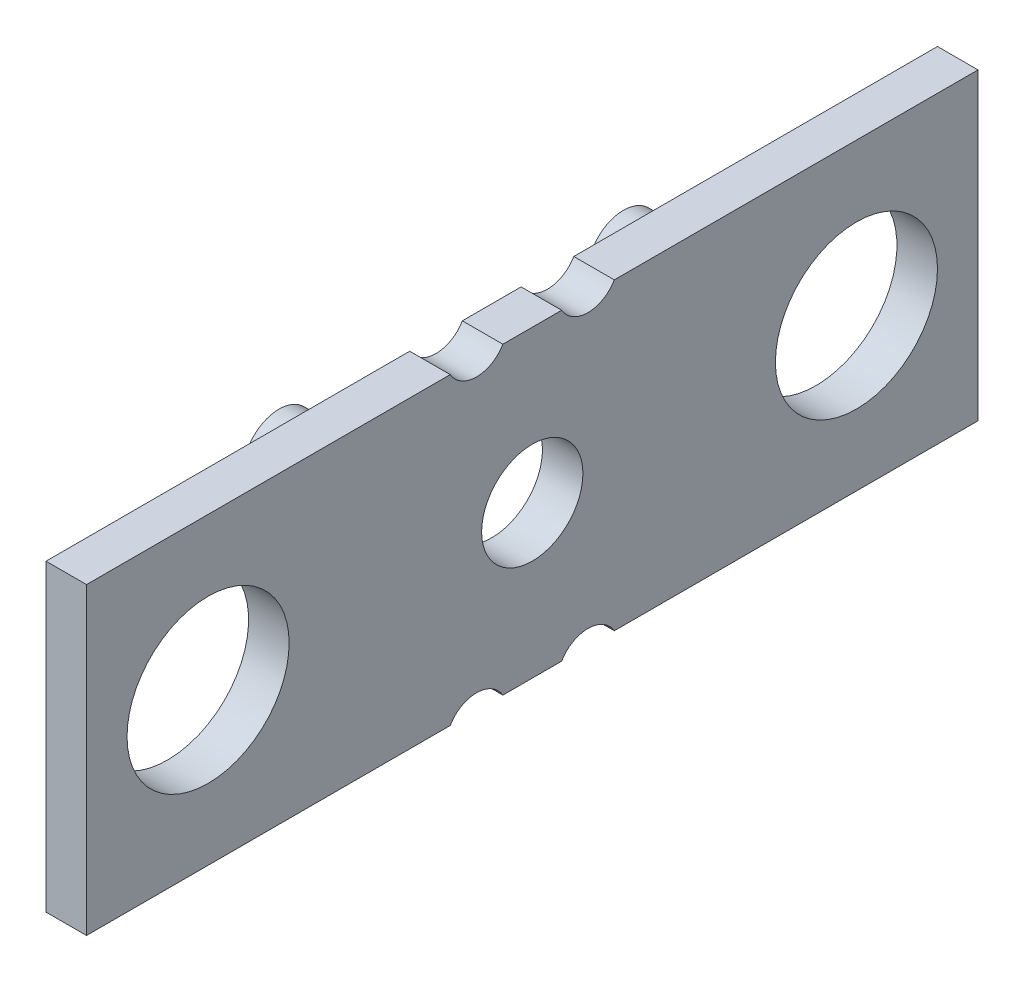
ISO-10303-21;
HEADER;
FILE_DESCRIPTION(('STEP AP214'),'2;1');
FILE_NAME('part.step','',(''),(''),'','','');
FILE_SCHEMA(('AUTOMOTIVE_DESIGN { 1 0 10303 214 1 1 1 1 }'));
ENDSEC;
DATA;
#1=APPLICATION_CONTEXT('core data for automotive mechanical design processes');
#2=APPLICATION_PROTOCOL_DEFINITION('international standard','automotive_design',2000,#1);
#3=PRODUCT_CONTEXT('',#1,'mechanical');
#4=PRODUCT('Part','Part','',(#3));
#5=PRODUCT_RELATED_PRODUCT_CATEGORY('part','',(#4));
#6=PRODUCT_DEFINITION_FORMATION('','',#4);
#7=PRODUCT_DEFINITION_CONTEXT('part definition',#1,'design');
#8=PRODUCT_DEFINITION('design','',#6,#7);
#9=PRODUCT_DEFINITION_SHAPE('','',#8);
#10=(LENGTH_UNIT() NAMED_UNIT(*) SI_UNIT(.MILLI.,.METRE.));
#11=(NAMED_UNIT(*) PLANE_ANGLE_UNIT() SI_UNIT($,.RADIAN.));
#12=(NAMED_UNIT(*) SI_UNIT($,.STERADIAN.) SOLID_ANGLE_UNIT());
#13=UNCERTAINTY_MEASURE_WITH_UNIT(LENGTH_MEASURE(1.E-05),#10,'distance_accuracy_value','');
#14=(GEOMETRIC_REPRESENTATION_CONTEXT(3) GLOBAL_UNCERTAINTY_ASSIGNED_CONTEXT((#13)) GLOBAL_UNIT_ASSIGNED_CONTEXT((#10,
#11,#12)) REPRESENTATION_CONTEXT('',''));
#15=CARTESIAN_POINT('',(0.,0.,0.));
#16=DIRECTION('',(0.,0.,1.));
#17=DIRECTION('',(1.,0.,0.));
#18=AXIS2_PLACEMENT_3D('',#15,#16,#17);
#19=CARTESIAN_POINT('',(-4.,-15.,-8.0980762113533));
#20=DIRECTION('',(0.,-1.,0.));
#21=DIRECTION('',(0.,0.,-1.));
#22=AXIS2_PLACEMENT_3D('',#19,#20,#21);
#23=PLANE('',#22);
#24=DIRECTION('',(-1.,0.,0.));
#25=VECTOR('',#24,1.);
#26=CARTESIAN_POINT('',(0.,-15.,-8.0980762113533));
#27=LINE('',#26,#25);
#28=CARTESIAN_POINT('',(-4.,-15.,-8.0980762113533));
#29=VERTEX_POINT('',#28);
#30=CARTESIAN_POINT('',(0.,-15.,-8.0980762113533));
#31=VERTEX_POINT('',#30);
#32=EDGE_CURVE('E106',#29,#31,#27,.F.);
#33=ORIENTED_EDGE('',*,*,#32,.F.);
#34=DIRECTION('',(0.,0.,-1.));
#35=VECTOR('',#34,1.);
#36=CARTESIAN_POINT('',(-4.,-15.,-8.0980762113533));
#37=LINE('',#36,#35);
#38=CARTESIAN_POINT('',(-4.,-15.,-44.));
#39=VERTEX_POINT('',#38);
#40=EDGE_CURVE('E121',#29,#39,#37,.T.);
#41=ORIENTED_EDGE('',*,*,#40,.T.);
#42=DIRECTION('',(1.,0.,0.));
#43=VECTOR('',#42,1.);
#44=CARTESIAN_POINT('',(-4.,-15.,-44.));
#45=LINE('',#44,#43);
#46=CARTESIAN_POINT('',(0.,-15.,-44.));
#47=VERTEX_POINT('',#46);
#48=EDGE_CURVE('E129',#39,#47,#45,.T.);
#49=ORIENTED_EDGE('',*,*,#48,.T.);
#50=DIRECTION('',(0.,0.,1.));
#51=VECTOR('',#50,1.);
#52=CARTESIAN_POINT('',(0.,-15.,-44.));
#53=LINE('',#52,#51);
#54=EDGE_CURVE('E123',#31,#47,#53,.F.);
#55=ORIENTED_EDGE('',*,*,#54,.F.);
#56=EDGE_LOOP('',(#33,#41,#49,#55));
#57=FACE_BOUND('',#56,.T.);
#58=ADVANCED_FACE('F17',(#57),#23,.T.);
#59=CARTESIAN_POINT('',(-4.,-15.,2.9019237886467));
#60=DIRECTION('',(0.,-1.,0.));
#61=DIRECTION('',(0.,0.,-1.));
#62=AXIS2_PLACEMENT_3D('',#59,#60,#61);
#63=PLANE('',#62);
#64=DIRECTION('',(1.,0.,0.));
#65=VECTOR('',#64,1.);
#66=CARTESIAN_POINT('',(-4.,-15.,-2.9019237886467));
#67=LINE('',#66,#65);
#68=CARTESIAN_POINT('',(-4.,-15.,-2.9019237886467));
#69=VERTEX_POINT('',#68);
#70=CARTESIAN_POINT('',(0.,-15.,-2.9019237886467));
#71=VERTEX_POINT('',#70);
#72=EDGE_CURVE('E109',#69,#71,#67,.T.);
#73=ORIENTED_EDGE('',*,*,#72,.T.);
#74=DIRECTION('',(0.,0.,1.));
#75=VECTOR('',#74,1.);
#76=CARTESIAN_POINT('',(0.,-15.,-2.9019237886467));
#77=LINE('',#76,#75);
#78=CARTESIAN_POINT('',(0.,-15.,2.9019237886467));
#79=VERTEX_POINT('',#78);
#80=EDGE_CURVE('E143',#79,#71,#77,.F.);
#81=ORIENTED_EDGE('',*,*,#80,.F.);
#82=DIRECTION('',(-1.,0.,0.));
#83=VECTOR('',#82,1.);
#84=CARTESIAN_POINT('',(0.,-15.,2.9019237886467));
#85=LINE('',#84,#83);
#86=CARTESIAN_POINT('',(-4.,-15.,2.9019237886467));
#87=VERTEX_POINT('',#86);
#88=EDGE_CURVE('E148',#87,#79,#85,.F.);
#89=ORIENTED_EDGE('',*,*,#88,.F.);
#90=DIRECTION('',(0.,0.,-1.));
#91=VECTOR('',#90,1.);
#92=CARTESIAN_POINT('',(-4.,-15.,2.9019237886467));
#93=LINE('',#92,#91);
#94=EDGE_CURVE('E152',#87,#69,#93,.T.);
#95=ORIENTED_EDGE('',*,*,#94,.T.);
#96=EDGE_LOOP('',(#73,#81,#89,#95));
#97=FACE_BOUND('',#96,.T.);
#98=ADVANCED_FACE('F336',(#97),#63,.T.);
#99=CARTESIAN_POINT('',(-4.,15.,8.0980762113533));
#100=DIRECTION('',(0.,1.,0.));
#101=DIRECTION('',(0.,0.,1.));
#102=AXIS2_PLACEMENT_3D('',#99,#100,#101);
#103=PLANE('',#102);
#104=DIRECTION('',(-1.,0.,0.));
#105=VECTOR('',#104,1.);
#106=CARTESIAN_POINT('',(0.,15.,8.09807621135331));
#107=LINE('',#106,#105);
#108=CARTESIAN_POINT('',(-4.,15.,8.09807621135331));
#109=VERTEX_POINT('',#108);
#110=CARTESIAN_POINT('',(0.,15.,8.09807621135331));
#111=VERTEX_POINT('',#110);
#112=EDGE_CURVE('E156',#109,#111,#107,.F.);
#113=ORIENTED_EDGE('',*,*,#112,.F.);
#114=DIRECTION('',(0.,0.,1.));
#115=VECTOR('',#114,1.);
#116=CARTESIAN_POINT('',(-4.,15.,8.09807621135331));
#117=LINE('',#116,#115);
#118=CARTESIAN_POINT('',(-4.,15.,44.));
#119=VERTEX_POINT('',#118);
#120=EDGE_CURVE('E160',#109,#119,#117,.T.);
#121=ORIENTED_EDGE('',*,*,#120,.T.);
#122=DIRECTION('',(1.,0.,0.));
#123=VECTOR('',#122,1.);
#124=CARTESIAN_POINT('',(-4.,15.,44.));
#125=LINE('',#124,#123);
#126=CARTESIAN_POINT('',(0.,15.,44.));
#127=VERTEX_POINT('',#126);
#128=EDGE_CURVE('E165',#119,#127,#125,.T.);
#129=ORIENTED_EDGE('',*,*,#128,.T.);
#130=DIRECTION('',(0.,0.,-1.));
#131=VECTOR('',#130,1.);
#132=CARTESIAN_POINT('',(0.,15.,44.));
#133=LINE('',#132,#131);
#134=EDGE_CURVE('E170',#111,#127,#133,.F.);
#135=ORIENTED_EDGE('',*,*,#134,.F.);
#136=EDGE_LOOP('',(#113,#121,#129,#135));
#137=FACE_BOUND('',#136,.T.);
#138=ADVANCED_FACE('F341',(#137),#103,.T.);
#139=CARTESIAN_POINT('',(-4.,15.,-2.9019237886467));
#140=DIRECTION('',(0.,1.,0.));
#141=DIRECTION('',(0.,0.,1.));
#142=AXIS2_PLACEMENT_3D('',#139,#140,#141);
#143=PLANE('',#142);
#144=DIRECTION('',(1.,0.,0.));
#145=VECTOR('',#144,1.);
#146=CARTESIAN_POINT('',(-4.,15.,2.9019237886467));
#147=LINE('',#146,#145);
#148=CARTESIAN_POINT('',(-4.,15.,2.9019237886467));
#149=VERTEX_POINT('',#148);
#150=CARTESIAN_POINT('',(0.,15.,2.9019237886467));
#151=VERTEX_POINT('',#150);
#152=EDGE_CURVE('E174',#149,#151,#147,.T.);
#153=ORIENTED_EDGE('',*,*,#152,.T.);
#154=DIRECTION('',(0.,0.,-1.));
#155=VECTOR('',#154,1.);
#156=CARTESIAN_POINT('',(0.,15.,2.9019237886467));
#157=LINE('',#156,#155);
#158=CARTESIAN_POINT('',(0.,15.,-2.9019237886467));
#159=VERTEX_POINT('',#158);
#160=EDGE_CURVE('E179',#159,#151,#157,.F.);
#161=ORIENTED_EDGE('',*,*,#160,.F.);
#162=DIRECTION('',(-1.,0.,0.));
#163=VECTOR('',#162,1.);
#164=CARTESIAN_POINT('',(0.,15.,-2.9019237886467));
#165=LINE('',#164,#163);
#166=CARTESIAN_POINT('',(-4.,15.,-2.9019237886467));
#167=VERTEX_POINT('',#166);
#168=EDGE_CURVE('E184',#167,#159,#165,.F.);
#169=ORIENTED_EDGE('',*,*,#168,.F.);
#170=DIRECTION('',(0.,0.,1.));
#171=VECTOR('',#170,1.);
#172=CARTESIAN_POINT('',(-4.,15.,-2.9019237886467));
#173=LINE('',#172,#171);
#174=EDGE_CURVE('E188',#167,#149,#173,.T.);
#175=ORIENTED_EDGE('',*,*,#174,.T.);
#176=EDGE_LOOP('',(#153,#161,#169,#175));
#177=FACE_BOUND('',#176,.T.);
#178=ADVANCED_FACE('F347',(#177),#143,.T.);
#179=CARTESIAN_POINT('',(-4.,-15.,44.));
#180=DIRECTION('',(0.,0.,1.));
#181=DIRECTION('',(1.,0.,0.));
#182=AXIS2_PLACEMENT_3D('',#179,#180,#181);
#183=PLANE('',#182);
#184=DIRECTION('',(0.,1.,0.));
#185=VECTOR('',#184,1.);
#186=CARTESIAN_POINT('',(0.,-15.,44.));
#187=LINE('',#186,#185);
#188=CARTESIAN_POINT('',(0.,-15.,44.));
#189=VERTEX_POINT('',#188);
#190=EDGE_CURVE('E193',#127,#189,#187,.F.);
#191=ORIENTED_EDGE('',*,*,#190,.F.);
#192=ORIENTED_EDGE('',*,*,#128,.F.);
#193=DIRECTION('',(0.,-1.,0.));
#194=VECTOR('',#193,1.);
#195=CARTESIAN_POINT('',(-4.,15.,44.));
#196=LINE('',#195,#194);
#197=CARTESIAN_POINT('',(-4.,-15.,44.));
#198=VERTEX_POINT('',#197);
#199=EDGE_CURVE('E197',#119,#198,#196,.T.);
#200=ORIENTED_EDGE('',*,*,#199,.T.);
#201=DIRECTION('',(1.,0.,0.));
#202=VECTOR('',#201,1.);
#203=CARTESIAN_POINT('',(-4.,-15.,44.));
#204=LINE('',#203,#202);
#205=EDGE_CURVE('E202',#198,#189,#204,.T.);
#206=ORIENTED_EDGE('',*,*,#205,.T.);
#207=EDGE_LOOP('',(#191,#192,#200,#206));
#208=FACE_BOUND('',#207,.T.);
#209=ADVANCED_FACE('F351',(#208),#183,.T.);
#210=CARTESIAN_POINT('',(-4.,-15.,44.));
#211=DIRECTION('',(0.,-1.,0.));
#212=DIRECTION('',(0.,0.,-1.));
#213=AXIS2_PLACEMENT_3D('',#210,#211,#212);
#214=PLANE('',#213);
#215=DIRECTION('',(1.,0.,0.));
#216=VECTOR('',#215,1.);
#217=CARTESIAN_POINT('',(-4.,-15.,8.0980762113533));
#218=LINE('',#217,#216);
#219=CARTESIAN_POINT('',(-4.,-15.,8.0980762113533));
#220=VERTEX_POINT('',#219);
#221=CARTESIAN_POINT('',(0.,-15.,8.0980762113533));
#222=VERTEX_POINT('',#221);
#223=EDGE_CURVE('E207',#220,#222,#218,.T.);
#224=ORIENTED_EDGE('',*,*,#223,.T.);
#225=DIRECTION('',(0.,0.,1.));
#226=VECTOR('',#225,1.);
#227=CARTESIAN_POINT('',(0.,-15.,8.0980762113533));
#228=LINE('',#227,#226);
#229=EDGE_CURVE('E212',#189,#222,#228,.F.);
#230=ORIENTED_EDGE('',*,*,#229,.F.);
#231=ORIENTED_EDGE('',*,*,#205,.F.);
#232=DIRECTION('',(0.,0.,-1.));
#233=VECTOR('',#232,1.);
#234=CARTESIAN_POINT('',(-4.,-15.,44.));
#235=LINE('',#234,#233);
#236=EDGE_CURVE('E217',#198,#220,#235,.T.);
#237=ORIENTED_EDGE('',*,*,#236,.T.);
#238=EDGE_LOOP('',(#224,#230,#231,#237));
#239=FACE_BOUND('',#238,.T.);
#240=ADVANCED_FACE('F355',(#239),#214,.T.);
#241=CARTESIAN_POINT('',(0.,-15.,-44.));
#242=DIRECTION('',(0.,0.,-1.));
#243=DIRECTION('',(-1.,0.,0.));
#244=AXIS2_PLACEMENT_3D('',#241,#242,#243);
#245=PLANE('',#244);
#246=DIRECTION('',(0.,-1.,0.));
#247=VECTOR('',#246,1.);
#248=CARTESIAN_POINT('',(0.,15.,-44.));
#249=LINE('',#248,#247);
#250=CARTESIAN_POINT('',(0.,15.,-44.));
#251=VERTEX_POINT('',#250);
#252=EDGE_CURVE('E222',#47,#251,#249,.F.);
#253=ORIENTED_EDGE('',*,*,#252,.F.);
#254=ORIENTED_EDGE('',*,*,#48,.F.);
#255=DIRECTION('',(0.,1.,0.));
#256=VECTOR('',#255,1.);
#257=CARTESIAN_POINT('',(-4.,-15.,-44.));
#258=LINE('',#257,#256);
#259=CARTESIAN_POINT('',(-4.,15.,-44.));
#260=VERTEX_POINT('',#259);
#261=EDGE_CURVE('E128',#39,#260,#258,.T.);
#262=ORIENTED_EDGE('',*,*,#261,.T.);
#263=DIRECTION('',(1.,0.,0.));
#264=VECTOR('',#263,1.);
#265=CARTESIAN_POINT('',(-4.,15.,-44.));
#266=LINE('',#265,#264);
#267=EDGE_CURVE('E229',#260,#251,#266,.T.);
#268=ORIENTED_EDGE('',*,*,#267,.T.);
#269=EDGE_LOOP('',(#253,#254,#262,#268));
#270=FACE_BOUND('',#269,.T.);
#271=ADVANCED_FACE('F359',(#270),#245,.T.);
#272=CARTESIAN_POINT('',(-4.,15.,-44.));
#273=DIRECTION('',(0.,1.,0.));
#274=DIRECTION('',(0.,0.,1.));
#275=AXIS2_PLACEMENT_3D('',#272,#273,#274);
#276=PLANE('',#275);
#277=DIRECTION('',(1.,0.,0.));
#278=VECTOR('',#277,1.);
#279=CARTESIAN_POINT('',(-4.,15.,-8.0980762113533));
#280=LINE('',#279,#278);
#281=CARTESIAN_POINT('',(-4.,15.,-8.0980762113533));
#282=VERTEX_POINT('',#281);
#283=CARTESIAN_POINT('',(0.,15.,-8.0980762113533));
#284=VERTEX_POINT('',#283);
#285=EDGE_CURVE('E32',#282,#284,#280,.T.);
#286=ORIENTED_EDGE('',*,*,#285,.T.);
#287=DIRECTION('',(0.,0.,-1.));
#288=VECTOR('',#287,1.);
#289=CARTESIAN_POINT('',(0.,15.,-8.0980762113533));
#290=LINE('',#289,#288);
#291=EDGE_CURVE('E237',#251,#284,#290,.F.);
#292=ORIENTED_EDGE('',*,*,#291,.F.);
#293=ORIENTED_EDGE('',*,*,#267,.F.);
#294=DIRECTION('',(0.,0.,1.));
#295=VECTOR('',#294,1.);
#296=CARTESIAN_POINT('',(-4.,15.,-44.));
#297=LINE('',#296,#295);
#298=EDGE_CURVE('E115',#260,#282,#297,.T.);
#299=ORIENTED_EDGE('',*,*,#298,.T.);
#300=EDGE_LOOP('',(#286,#292,#293,#299));
#301=FACE_BOUND('',#300,.T.);
#302=ADVANCED_FACE('F363',(#301),#276,.T.);
#303=CARTESIAN_POINT('',(-4.,-15.,44.));
#304=DIRECTION('',(-1.,0.,0.));
#305=DIRECTION('',(0.,1.,0.));
#306=AXIS2_PLACEMENT_3D('',#303,#304,#305);
#307=PLANE('',#306);
#308=ORIENTED_EDGE('',*,*,#40,.F.);
#309=CARTESIAN_POINT('',(-4.,-16.5,-5.5));
#310=DIRECTION('',(1.,0.,0.));
#311=DIRECTION('',(0.,0.500000000000001,-0.866025403784438));
#312=AXIS2_PLACEMENT_3D('',#309,#310,#311);
#313=CIRCLE('',#312,3.);
#314=EDGE_CURVE('E103',#29,#69,#313,.T.);
#315=ORIENTED_EDGE('',*,*,#314,.T.);
#316=ORIENTED_EDGE('',*,*,#94,.F.);
#317=CARTESIAN_POINT('',(-4.,-16.5,5.5));
#318=DIRECTION('',(1.,0.,0.));
#319=DIRECTION('',(0.,0.500000000000003,-0.866025403784437));
#320=AXIS2_PLACEMENT_3D('',#317,#318,#319);
#321=CIRCLE('',#320,3.);
#322=EDGE_CURVE('E114',#87,#220,#321,.T.);
#323=ORIENTED_EDGE('',*,*,#322,.T.);
#324=ORIENTED_EDGE('',*,*,#236,.F.);
#325=ORIENTED_EDGE('',*,*,#199,.F.);
#326=ORIENTED_EDGE('',*,*,#120,.F.);
#327=CARTESIAN_POINT('',(-4.,16.5,5.5));
#328=DIRECTION('',(1.,0.,0.));
#329=DIRECTION('',(0.,-0.500000000000001,0.866025403784438));
#330=AXIS2_PLACEMENT_3D('',#327,#328,#329);
#331=CIRCLE('',#330,3.);
#332=EDGE_CURVE('E252',#109,#149,#331,.T.);
#333=ORIENTED_EDGE('',*,*,#332,.T.);
#334=ORIENTED_EDGE('',*,*,#174,.F.);
#335=CARTESIAN_POINT('',(-4.,16.5,-5.5));
#336=DIRECTION('',(1.,0.,0.));
#337=DIRECTION('',(0.,-0.500000000000004,0.866025403784436));
#338=AXIS2_PLACEMENT_3D('',#335,#336,#337);
#339=CIRCLE('',#338,3.);
#340=EDGE_CURVE('E257',#167,#282,#339,.T.);
#341=ORIENTED_EDGE('',*,*,#340,.T.);
#342=ORIENTED_EDGE('',*,*,#298,.F.);
#343=ORIENTED_EDGE('',*,*,#261,.F.);
#344=EDGE_LOOP('',(#308,#315,#316,#323,#324,#325,#326,#333,#334,#341,#342,#343));
#345=FACE_BOUND('',#344,.T.);
#346=CARTESIAN_POINT('',(-4.,0.,-32.));
#347=DIRECTION('',(1.,0.,0.));
#348=DIRECTION('',(0.,0.,1.));
#349=AXIS2_PLACEMENT_3D('',#346,#347,#348);
#350=CIRCLE('',#349,8.);
#351=CARTESIAN_POINT('',(-4.,0.,-24.));
#352=VERTEX_POINT('',#351);
#353=EDGE_CURVE('E261',#352,#352,#350,.T.);
#354=ORIENTED_EDGE('',*,*,#353,.T.);
#355=EDGE_LOOP('',(#354));
#356=FACE_BOUND('',#355,.T.);
#357=CARTESIAN_POINT('',(-4.,0.,32.));
#358=DIRECTION('',(1.,0.,0.));
#359=DIRECTION('',(0.,0.,1.));
#360=AXIS2_PLACEMENT_3D('',#357,#358,#359);
#361=CIRCLE('',#360,8.);
#362=CARTESIAN_POINT('',(-4.,0.,40.));
#363=VERTEX_POINT('',#362);
#364=EDGE_CURVE('E266',#363,#363,#361,.T.);
#365=ORIENTED_EDGE('',*,*,#364,.T.);
#366=EDGE_LOOP('',(#365));
#367=FACE_BOUND('',#366,.T.);
#368=CARTESIAN_POINT('',(-4.,0.,0.));
#369=DIRECTION('',(1.,0.,0.));
#370=DIRECTION('',(0.,-1.42053898954946E-07,0.99999999999999));
#371=AXIS2_PLACEMENT_3D('',#368,#369,#370);
#372=CIRCLE('',#371,5.);
#373=CARTESIAN_POINT('',(-4.,-7.10269494774728E-07,4.99999999999995));
#374=VERTEX_POINT('',#373);
#375=EDGE_CURVE('E269',#374,#374,#372,.T.);
#376=ORIENTED_EDGE('',*,*,#375,.T.);
#377=EDGE_LOOP('',(#376));
#378=FACE_BOUND('',#377,.T.);
#379=CARTESIAN_POINT('',(-4.,-9.,17.));
#380=DIRECTION('',(1.,0.,0.));
#381=DIRECTION('',(0.,0.,1.));
#382=AXIS2_PLACEMENT_3D('',#379,#380,#381);
#383=CIRCLE('',#382,3.5);
#384=CARTESIAN_POINT('',(-4.,-9.,20.5));
#385=VERTEX_POINT('',#384);
#386=EDGE_CURVE('E272',#385,#385,#383,.T.);
#387=ORIENTED_EDGE('',*,*,#386,.T.);
#388=EDGE_LOOP('',(#387));
#389=FACE_BOUND('',#388,.T.);
#390=CARTESIAN_POINT('',(-4.,-9.,-17.));
#391=DIRECTION('',(1.,0.,0.));
#392=DIRECTION('',(0.,-1.42053860230366E-07,0.99999999999999));
#393=AXIS2_PLACEMENT_3D('',#390,#391,#392);
#394=CIRCLE('',#393,3.5);
#395=CARTESIAN_POINT('',(-4.,-9.00000049718851,-13.5));
#396=VERTEX_POINT('',#395);
#397=EDGE_CURVE('E275',#396,#396,#394,.T.);
#398=ORIENTED_EDGE('',*,*,#397,.T.);
#399=EDGE_LOOP('',(#398));
#400=FACE_BOUND('',#399,.T.);
#401=CARTESIAN_POINT('',(-4.,9.,17.));
#402=DIRECTION('',(1.,0.,0.));
#403=DIRECTION('',(0.,0.,1.));
#404=AXIS2_PLACEMENT_3D('',#401,#402,#403);
#405=CIRCLE('',#404,3.5);
#406=CARTESIAN_POINT('',(-4.,9.00000000000001,20.5));
#407=VERTEX_POINT('',#406);
#408=EDGE_CURVE('E278',#407,#407,#405,.T.);
#409=ORIENTED_EDGE('',*,*,#408,.T.);
#410=EDGE_LOOP('',(#409));
#411=FACE_BOUND('',#410,.T.);
#412=CARTESIAN_POINT('',(-4.,9.,-17.));
#413=DIRECTION('',(1.,0.,0.));
#414=DIRECTION('',(0.,-1.42053915551193E-07,0.99999999999999));
#415=AXIS2_PLACEMENT_3D('',#412,#413,#414);
#416=CIRCLE('',#415,3.5);
#417=CARTESIAN_POINT('',(-4.,8.9999995028113,-13.5));
#418=VERTEX_POINT('',#417);
#419=EDGE_CURVE('E281',#418,#418,#416,.T.);
#420=ORIENTED_EDGE('',*,*,#419,.T.);
#421=EDGE_LOOP('',(#420));
#422=FACE_BOUND('',#421,.T.);
#423=ADVANCED_FACE('F125',(#345,#356,#367,#378,#389,#400,#411,#422),#307,.T.);
#424=CARTESIAN_POINT('',(0.,-15.,44.));
#425=DIRECTION('',(1.,0.,0.));
#426=DIRECTION('',(0.,0.,-1.));
#427=AXIS2_PLACEMENT_3D('',#424,#425,#426);
#428=PLANE('',#427);
#429=CARTESIAN_POINT('',(0.,-16.5,-5.5));
#430=DIRECTION('',(-1.,0.,0.));
#431=DIRECTION('',(0.,0.500000000000005,0.866025403784436));
#432=AXIS2_PLACEMENT_3D('',#429,#430,#431);
#433=CIRCLE('',#432,3.);
#434=EDGE_CURVE('E284',#31,#71,#433,.F.);
#435=ORIENTED_EDGE('',*,*,#434,.F.);
#436=ORIENTED_EDGE('',*,*,#54,.T.);
#437=ORIENTED_EDGE('',*,*,#252,.T.);
#438=ORIENTED_EDGE('',*,*,#291,.T.);
#439=CARTESIAN_POINT('',(0.,16.5,-5.5));
#440=DIRECTION('',(-1.,0.,0.));
#441=DIRECTION('',(0.,-0.500000000000003,-0.866025403784437));
#442=AXIS2_PLACEMENT_3D('',#439,#440,#441);
#443=CIRCLE('',#442,3.);
#444=EDGE_CURVE('E37',#159,#284,#443,.F.);
#445=ORIENTED_EDGE('',*,*,#444,.F.);
#446=ORIENTED_EDGE('',*,*,#160,.T.);
#447=CARTESIAN_POINT('',(0.,16.5,5.5));
#448=DIRECTION('',(-1.,0.,0.));
#449=DIRECTION('',(0.,-0.500000000000002,-0.866025403784438));
#450=AXIS2_PLACEMENT_3D('',#447,#448,#449);
#451=CIRCLE('',#450,3.);
#452=EDGE_CURVE('E289',#111,#151,#451,.F.);
#453=ORIENTED_EDGE('',*,*,#452,.F.);
#454=ORIENTED_EDGE('',*,*,#134,.T.);
#455=ORIENTED_EDGE('',*,*,#190,.T.);
#456=ORIENTED_EDGE('',*,*,#229,.T.);
#457=CARTESIAN_POINT('',(0.,-16.5,5.5));
#458=DIRECTION('',(-1.,0.,0.));
#459=DIRECTION('',(0.,0.500000000000002,0.866025403784438));
#460=AXIS2_PLACEMENT_3D('',#457,#458,#459);
#461=CIRCLE('',#460,3.);
#462=EDGE_CURVE('E293',#79,#222,#461,.F.);
#463=ORIENTED_EDGE('',*,*,#462,.F.);
#464=ORIENTED_EDGE('',*,*,#80,.T.);
#465=EDGE_LOOP('',(#435,#436,#437,#438,#445,#446,#453,#454,#455,#456,#463,#464));
#466=FACE_BOUND('',#465,.T.);
#467=CARTESIAN_POINT('',(0.,0.,32.));
#468=DIRECTION('',(-1.,0.,0.));
#469=DIRECTION('',(0.,0.,-1.));
#470=AXIS2_PLACEMENT_3D('',#467,#468,#469);
#471=CIRCLE('',#470,8.);
#472=CARTESIAN_POINT('',(0.,0.,24.));
#473=VERTEX_POINT('',#472);
#474=EDGE_CURVE('E297',#473,#473,#471,.F.);
#475=ORIENTED_EDGE('',*,*,#474,.F.);
#476=EDGE_LOOP('',(#475));
#477=FACE_BOUND('',#476,.T.);
#478=CARTESIAN_POINT('',(0.,0.,-32.));
#479=DIRECTION('',(-1.,0.,0.));
#480=DIRECTION('',(0.,0.,-1.));
#481=AXIS2_PLACEMENT_3D('',#478,#479,#480);
#482=CIRCLE('',#481,8.);
#483=CARTESIAN_POINT('',(0.,0.,-40.));
#484=VERTEX_POINT('',#483);
#485=EDGE_CURVE('E302',#484,#484,#482,.F.);
#486=ORIENTED_EDGE('',*,*,#485,.F.);
#487=EDGE_LOOP('',(#486));
#488=FACE_BOUND('',#487,.T.);
#489=CARTESIAN_POINT('',(0.,0.,0.));
#490=DIRECTION('',(-1.,0.,0.));
#491=DIRECTION('',(0.,0.,-1.));
#492=AXIS2_PLACEMENT_3D('',#489,#490,#491);
#493=CIRCLE('',#492,5.);
#494=CARTESIAN_POINT('',(0.,0.,-5.));
#495=VERTEX_POINT('',#494);
#496=EDGE_CURVE('E305',#495,#495,#493,.F.);
#497=ORIENTED_EDGE('',*,*,#496,.F.);
#498=EDGE_LOOP('',(#497));
#499=FACE_BOUND('',#498,.T.);
#500=ADVANCED_FACE('F370',(#466,#477,#488,#499),#428,.T.);
#501=CARTESIAN_POINT('',(-8.,5.49999999999997,-13.4999997312741));
#502=DIRECTION('',(-1.,0.,0.));
#503=DIRECTION('',(0.,1.,0.));
#504=AXIS2_PLACEMENT_3D('',#501,#502,#503);
#505=PLANE('',#504);
#506=CARTESIAN_POINT('',(-8.,9.,-17.));
#507=DIRECTION('',(-1.,0.,0.));
#508=DIRECTION('',(0.,0.,-1.));
#509=AXIS2_PLACEMENT_3D('',#506,#507,#508);
#510=CIRCLE('',#509,3.5);
#511=CARTESIAN_POINT('',(-8.,9.,-20.5));
#512=VERTEX_POINT('',#511);
#513=EDGE_CURVE('E308',#512,#512,#510,.F.);
#514=ORIENTED_EDGE('',*,*,#513,.F.);
#515=EDGE_LOOP('',(#514));
#516=FACE_BOUND('',#515,.T.);
#517=ADVANCED_FACE('F332',(#516),#505,.T.);
#518=CARTESIAN_POINT('',(-8.,5.49999999999997,20.5000002687259));
#519=DIRECTION('',(-1.,0.,0.));
#520=DIRECTION('',(0.,1.,0.));
#521=AXIS2_PLACEMENT_3D('',#518,#519,#520);
#522=PLANE('',#521);
#523=CARTESIAN_POINT('',(-8.,9.,17.));
#524=DIRECTION('',(-1.,0.,0.));
#525=DIRECTION('',(0.,0.,-1.));
#526=AXIS2_PLACEMENT_3D('',#523,#524,#525);
#527=CIRCLE('',#526,3.5);
#528=CARTESIAN_POINT('',(-8.,9.,13.5));
#529=VERTEX_POINT('',#528);
#530=EDGE_CURVE('E311',#529,#529,#527,.F.);
#531=ORIENTED_EDGE('',*,*,#530,.F.);
#532=EDGE_LOOP('',(#531));
#533=FACE_BOUND('',#532,.T.);
#534=ADVANCED_FACE('F322',(#533),#522,.T.);
#535=CARTESIAN_POINT('',(-8.,-12.5,-13.4999997312744));
#536=DIRECTION('',(-1.,0.,0.));
#537=DIRECTION('',(0.,1.,0.));
#538=AXIS2_PLACEMENT_3D('',#535,#536,#537);
#539=PLANE('',#538);
#540=CARTESIAN_POINT('',(-8.,-9.,-17.));
#541=DIRECTION('',(-1.,0.,0.));
#542=DIRECTION('',(0.,0.,-1.));
#543=AXIS2_PLACEMENT_3D('',#540,#541,#542);
#544=CIRCLE('',#543,3.5);
#545=CARTESIAN_POINT('',(-8.,-9.,-20.5));
#546=VERTEX_POINT('',#545);
#547=EDGE_CURVE('E25',#546,#546,#544,.F.);
#548=ORIENTED_EDGE('',*,*,#547,.F.);
#549=EDGE_LOOP('',(#548));
#550=FACE_BOUND('',#549,.T.);
#551=ADVANCED_FACE('F319',(#550),#539,.T.);
#552=CARTESIAN_POINT('',(-8.,-12.5,20.5000002680337));
#553=DIRECTION('',(-1.,0.,0.));
#554=DIRECTION('',(0.,1.,0.));
#555=AXIS2_PLACEMENT_3D('',#552,#553,#554);
#556=PLANE('',#555);
#557=CARTESIAN_POINT('',(-8.,-9.,17.));
#558=DIRECTION('',(-1.,0.,0.));
#559=DIRECTION('',(0.,0.,-1.));
#560=AXIS2_PLACEMENT_3D('',#557,#558,#559);
#561=CIRCLE('',#560,3.5);
#562=CARTESIAN_POINT('',(-8.,-9.,13.5));
#563=VERTEX_POINT('',#562);
#564=EDGE_CURVE('E11',#563,#563,#561,.F.);
#565=ORIENTED_EDGE('',*,*,#564,.F.);
#566=EDGE_LOOP('',(#565));
#567=FACE_BOUND('',#566,.T.);
#568=ADVANCED_FACE('F321',(#567),#556,.T.);
#569=CARTESIAN_POINT('',(-4.,16.5,-5.5));
#570=DIRECTION('',(1.,0.,0.));
#571=DIRECTION('',(0.,-0.500000000000002,0.866025403784437));
#572=AXIS2_PLACEMENT_3D('',#569,#570,#571);
#573=CYLINDRICAL_SURFACE('',#572,3.);
#574=ORIENTED_EDGE('',*,*,#444,.T.);
#575=ORIENTED_EDGE('',*,*,#285,.F.);
#576=ORIENTED_EDGE('',*,*,#340,.F.);
#577=ORIENTED_EDGE('',*,*,#168,.T.);
#578=EDGE_LOOP('',(#574,#575,#576,#577));
#579=FACE_BOUND('',#578,.T.);
#580=ADVANCED_FACE('F329',(#579),#573,.F.);
#581=CARTESIAN_POINT('',(-4.,16.5,5.5));
#582=DIRECTION('',(1.,0.,0.));
#583=DIRECTION('',(0.,-0.500000000000001,0.866025403784438));
#584=AXIS2_PLACEMENT_3D('',#581,#582,#583);
#585=CYLINDRICAL_SURFACE('',#584,3.);
#586=ORIENTED_EDGE('',*,*,#452,.T.);
#587=ORIENTED_EDGE('',*,*,#152,.F.);
#588=ORIENTED_EDGE('',*,*,#332,.F.);
#589=ORIENTED_EDGE('',*,*,#112,.T.);
#590=EDGE_LOOP('',(#586,#587,#588,#589));
#591=FACE_BOUND('',#590,.T.);
#592=ADVANCED_FACE('F475',(#591),#585,.F.);
#593=CARTESIAN_POINT('',(-4.,-16.5,5.5));
#594=DIRECTION('',(1.,0.,0.));
#595=DIRECTION('',(0.,0.500000000000003,-0.866025403784437));
#596=AXIS2_PLACEMENT_3D('',#593,#594,#595);
#597=CYLINDRICAL_SURFACE('',#596,3.);
#598=ORIENTED_EDGE('',*,*,#462,.T.);
#599=ORIENTED_EDGE('',*,*,#223,.F.);
#600=ORIENTED_EDGE('',*,*,#322,.F.);
#601=ORIENTED_EDGE('',*,*,#88,.T.);
#602=EDGE_LOOP('',(#598,#599,#600,#601));
#603=FACE_BOUND('',#602,.T.);
#604=ADVANCED_FACE('F466',(#603),#597,.F.);
#605=CARTESIAN_POINT('',(-4.,-16.5,-5.5));
#606=DIRECTION('',(1.,0.,0.));
#607=DIRECTION('',(0.,0.500000000000002,-0.866025403784437));
#608=AXIS2_PLACEMENT_3D('',#605,#606,#607);
#609=CYLINDRICAL_SURFACE('',#608,3.);
#610=ORIENTED_EDGE('',*,*,#434,.T.);
#611=ORIENTED_EDGE('',*,*,#72,.F.);
#612=ORIENTED_EDGE('',*,*,#314,.F.);
#613=ORIENTED_EDGE('',*,*,#32,.T.);
#614=EDGE_LOOP('',(#610,#611,#612,#613));
#615=FACE_BOUND('',#614,.T.);
#616=ADVANCED_FACE('F105',(#615),#609,.F.);
#617=CARTESIAN_POINT('',(-4.,0.,-32.));
#618=DIRECTION('',(1.,0.,0.));
#619=DIRECTION('',(0.,1.16872124234655E-09,1.));
#620=AXIS2_PLACEMENT_3D('',#617,#618,#619);
#621=CYLINDRICAL_SURFACE('',#620,8.);
#622=ORIENTED_EDGE('',*,*,#353,.F.);
#623=EDGE_LOOP('',(#622));
#624=FACE_BOUND('',#623,.T.);
#625=ORIENTED_EDGE('',*,*,#485,.T.);
#626=EDGE_LOOP('',(#625));
#627=FACE_BOUND('',#626,.T.);
#628=ADVANCED_FACE('F448',(#624,#627),#621,.F.);
#629=CARTESIAN_POINT('',(-4.,0.,0.));
#630=DIRECTION('',(1.,0.,0.));
#631=DIRECTION('',(0.,0.,1.));
#632=AXIS2_PLACEMENT_3D('',#629,#630,#631);
#633=CYLINDRICAL_SURFACE('',#632,5.);
#634=ORIENTED_EDGE('',*,*,#375,.F.);
#635=EDGE_LOOP('',(#634));
#636=FACE_BOUND('',#635,.T.);
#637=ORIENTED_EDGE('',*,*,#496,.T.);
#638=EDGE_LOOP('',(#637));
#639=FACE_BOUND('',#638,.T.);
#640=ADVANCED_FACE('F394',(#636,#639),#633,.F.);
#641=CARTESIAN_POINT('',(-4.,0.,32.));
#642=DIRECTION('',(1.,0.,0.));
#643=DIRECTION('',(0.,1.16872079825734E-09,1.));
#644=AXIS2_PLACEMENT_3D('',#641,#642,#643);
#645=CYLINDRICAL_SURFACE('',#644,8.);
#646=ORIENTED_EDGE('',*,*,#364,.F.);
#647=EDGE_LOOP('',(#646));
#648=FACE_BOUND('',#647,.T.);
#649=ORIENTED_EDGE('',*,*,#474,.T.);
#650=EDGE_LOOP('',(#649));
#651=FACE_BOUND('',#650,.T.);
#652=ADVANCED_FACE('F384',(#648,#651),#645,.F.);
#653=CARTESIAN_POINT('',(-8.,9.,-17.));
#654=DIRECTION('',(1.,0.,0.));
#655=DIRECTION('',(0.,1.42067250530682E-07,0.99999999999999));
#656=AXIS2_PLACEMENT_3D('',#653,#654,#655);
#657=CYLINDRICAL_SURFACE('',#656,3.5);
#658=ORIENTED_EDGE('',*,*,#513,.T.);
#659=EDGE_LOOP('',(#658));
#660=FACE_BOUND('',#659,.T.);
#661=ORIENTED_EDGE('',*,*,#419,.F.);
#662=EDGE_LOOP('',(#661));
#663=FACE_BOUND('',#662,.T.);
#664=ADVANCED_FACE('F380',(#660,#663),#657,.T.);
#665=CARTESIAN_POINT('',(-8.,9.,17.));
#666=DIRECTION('',(1.,0.,0.));
#667=DIRECTION('',(0.,1.42067251862949E-07,0.99999999999999));
#668=AXIS2_PLACEMENT_3D('',#665,#666,#667);
#669=CYLINDRICAL_SURFACE('',#668,3.5);
#670=ORIENTED_EDGE('',*,*,#530,.T.);
#671=EDGE_LOOP('',(#670));
#672=FACE_BOUND('',#671,.T.);
#673=ORIENTED_EDGE('',*,*,#408,.F.);
#674=EDGE_LOOP('',(#673));
#675=FACE_BOUND('',#674,.T.);
#676=ADVANCED_FACE('F383',(#672,#675),#669,.T.);
#677=CARTESIAN_POINT('',(-8.,-9.,-17.));
#678=DIRECTION('',(1.,0.,0.));
#679=DIRECTION('',(0.,1.42067083997228E-07,0.99999999999999));
#680=AXIS2_PLACEMENT_3D('',#677,#678,#679);
#681=CYLINDRICAL_SURFACE('',#680,3.5);
#682=ORIENTED_EDGE('',*,*,#547,.T.);
#683=EDGE_LOOP('',(#682));
#684=FACE_BOUND('',#683,.T.);
#685=ORIENTED_EDGE('',*,*,#397,.F.);
#686=EDGE_LOOP('',(#685));
#687=FACE_BOUND('',#686,.T.);
#688=ADVANCED_FACE('F316',(#684,#687),#681,.T.);
#689=CARTESIAN_POINT('',(-8.,-9.,17.));
#690=DIRECTION('',(1.,0.,0.));
#691=DIRECTION('',(0.,1.41701303702286E-07,0.99999999999999));
#692=AXIS2_PLACEMENT_3D('',#689,#690,#691);
#693=CYLINDRICAL_SURFACE('',#692,3.5);
#694=ORIENTED_EDGE('',*,*,#564,.T.);
#695=EDGE_LOOP('',(#694));
#696=FACE_BOUND('',#695,.T.);
#697=ORIENTED_EDGE('',*,*,#386,.F.);
#698=EDGE_LOOP('',(#697));
#699=FACE_BOUND('',#698,.T.);
#700=ADVANCED_FACE('F19',(#696,#699),#693,.T.);
#701=CLOSED_SHELL('',(#58,#98,#138,#178,#209,#240,#271,#302,#423,#500,#517,#534,#551,#568,#580,
#592,#604,#616,#628,#640,#652,#664,#676,#688,#700));
#702=MANIFOLD_SOLID_BREP('B1',#701);
#703=ADVANCED_BREP_SHAPE_REPRESENTATION('',(#18,#702),#14);
#704=SHAPE_DEFINITION_REPRESENTATION(#9,#703);
ENDSEC;
END-ISO-10303-21;
